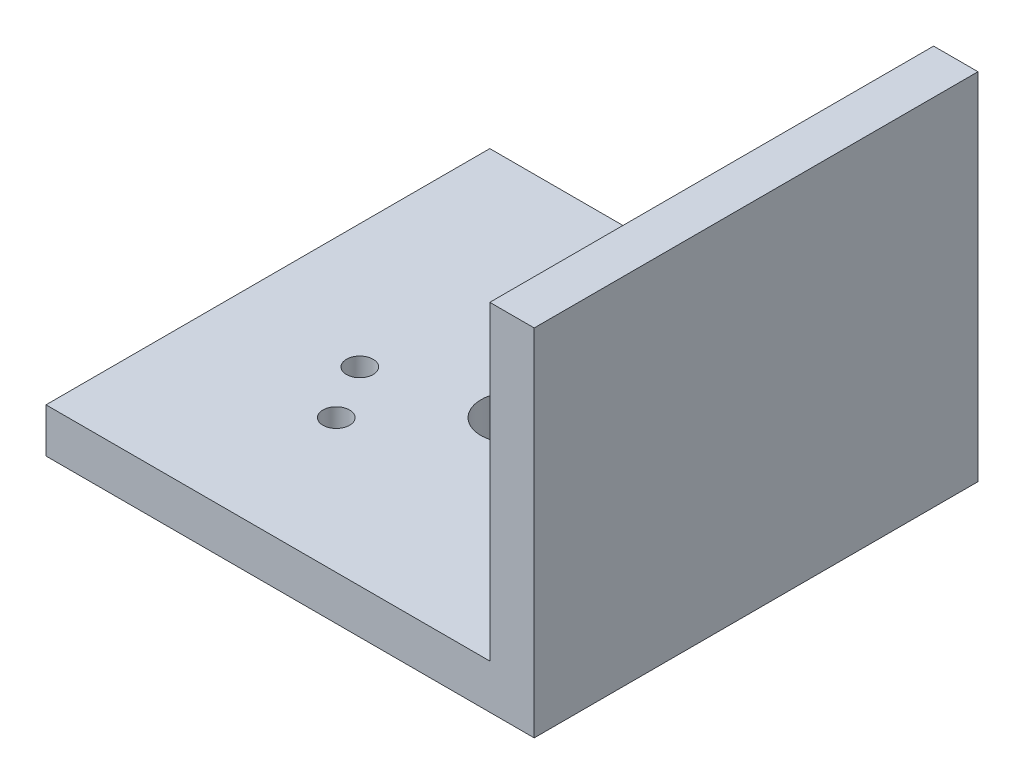
ISO-10303-21;
HEADER;
FILE_DESCRIPTION(('STEP AP214'),'2;1');
FILE_NAME('part.step','',(''),(''),'','','');
FILE_SCHEMA(('AUTOMOTIVE_DESIGN { 1 0 10303 214 1 1 1 1 }'));
ENDSEC;
DATA;
#1=APPLICATION_CONTEXT('core data for automotive mechanical design processes');
#2=APPLICATION_PROTOCOL_DEFINITION('international standard','automotive_design',2000,#1);
#3=PRODUCT_CONTEXT('',#1,'mechanical');
#4=PRODUCT('Part','Part','',(#3));
#5=PRODUCT_RELATED_PRODUCT_CATEGORY('part','',(#4));
#6=PRODUCT_DEFINITION_FORMATION('','',#4);
#7=PRODUCT_DEFINITION_CONTEXT('part definition',#1,'design');
#8=PRODUCT_DEFINITION('design','',#6,#7);
#9=PRODUCT_DEFINITION_SHAPE('','',#8);
#10=(LENGTH_UNIT() NAMED_UNIT(*) SI_UNIT(.MILLI.,.METRE.));
#11=(NAMED_UNIT(*) PLANE_ANGLE_UNIT() SI_UNIT($,.RADIAN.));
#12=(NAMED_UNIT(*) SI_UNIT($,.STERADIAN.) SOLID_ANGLE_UNIT());
#13=UNCERTAINTY_MEASURE_WITH_UNIT(LENGTH_MEASURE(1.E-05),#10,'distance_accuracy_value','');
#14=(GEOMETRIC_REPRESENTATION_CONTEXT(3) GLOBAL_UNCERTAINTY_ASSIGNED_CONTEXT((#13)) GLOBAL_UNIT_ASSIGNED_CONTEXT((#10,
#11,#12)) REPRESENTATION_CONTEXT('',''));
#15=CARTESIAN_POINT('',(0.,0.,0.));
#16=DIRECTION('',(0.,0.,1.));
#17=DIRECTION('',(1.,0.,0.));
#18=AXIS2_PLACEMENT_3D('',#15,#16,#17);
#19=CARTESIAN_POINT('',(-27.5,-2.5,25.));
#20=DIRECTION('',(1.,0.,0.));
#21=DIRECTION('',(0.,0.,-1.));
#22=AXIS2_PLACEMENT_3D('',#19,#20,#21);
#23=PLANE('',#22);
#24=DIRECTION('',(0.,-1.,0.));
#25=VECTOR('',#24,1.);
#26=CARTESIAN_POINT('',(-27.5,-2.5,-25.));
#27=LINE('',#26,#25);
#28=CARTESIAN_POINT('',(-27.5,2.5,-25.));
#29=VERTEX_POINT('',#28);
#30=CARTESIAN_POINT('',(-27.5,-2.5,-25.));
#31=VERTEX_POINT('',#30);
#32=EDGE_CURVE('E128',#29,#31,#27,.T.);
#33=ORIENTED_EDGE('',*,*,#32,.T.);
#34=DIRECTION('',(0.,0.,-1.));
#35=VECTOR('',#34,1.);
#36=CARTESIAN_POINT('',(-27.5,-2.5,25.));
#37=LINE('',#36,#35);
#38=CARTESIAN_POINT('',(-27.5,-2.5,25.));
#39=VERTEX_POINT('',#38);
#40=EDGE_CURVE('E11',#39,#31,#37,.T.);
#41=ORIENTED_EDGE('',*,*,#40,.F.);
#42=DIRECTION('',(0.,-1.,0.));
#43=VECTOR('',#42,1.);
#44=CARTESIAN_POINT('',(-27.5,-2.5,25.));
#45=LINE('',#44,#43);
#46=CARTESIAN_POINT('',(-27.5,2.5,25.));
#47=VERTEX_POINT('',#46);
#48=EDGE_CURVE('E145',#47,#39,#45,.T.);
#49=ORIENTED_EDGE('',*,*,#48,.F.);
#50=DIRECTION('',(0.,0.,-1.));
#51=VECTOR('',#50,1.);
#52=CARTESIAN_POINT('',(-27.5,2.5,25.));
#53=LINE('',#52,#51);
#54=EDGE_CURVE('E124',#47,#29,#53,.T.);
#55=ORIENTED_EDGE('',*,*,#54,.T.);
#56=EDGE_LOOP('',(#33,#41,#49,#55));
#57=FACE_BOUND('',#56,.T.);
#58=ADVANCED_FACE('F39',(#57),#23,.F.);
#59=CARTESIAN_POINT('',(27.5,-2.5,25.));
#60=DIRECTION('',(0.,1.,0.));
#61=DIRECTION('',(-1.,0.,0.));
#62=AXIS2_PLACEMENT_3D('',#59,#60,#61);
#63=PLANE('',#62);
#64=CARTESIAN_POINT('',(-9.89949493661161,-2.50000000000001,9.89949493661172));
#65=DIRECTION('',(0.,1.,0.));
#66=DIRECTION('',(0.500000000000004,0.,0.866025403784436));
#67=AXIS2_PLACEMENT_3D('',#64,#65,#66);
#68=CIRCLE('',#67,1.5);
#69=CARTESIAN_POINT('',(-9.14949493661161,-2.50000000000001,11.1985330422884));
#70=VERTEX_POINT('',#69);
#71=EDGE_CURVE('E296',#70,#70,#68,.T.);
#72=ORIENTED_EDGE('',*,*,#71,.T.);
#73=EDGE_LOOP('',(#72));
#74=FACE_BOUND('',#73,.T.);
#75=CARTESIAN_POINT('',(-13.522961568047,-2.50000000000001,3.62346663143535));
#76=DIRECTION('',(0.,1.,0.));
#77=DIRECTION('',(-0.500000000000004,0.,-0.866025403784436));
#78=AXIS2_PLACEMENT_3D('',#75,#76,#77);
#79=CIRCLE('',#78,1.5);
#80=CARTESIAN_POINT('',(-14.272961568047,-2.50000000000001,2.32442852575869));
#81=VERTEX_POINT('',#80);
#82=EDGE_CURVE('E300',#81,#81,#79,.T.);
#83=ORIENTED_EDGE('',*,*,#82,.T.);
#84=EDGE_LOOP('',(#83));
#85=FACE_BOUND('',#84,.T.);
#86=CARTESIAN_POINT('',(13.522961568047,-2.50000000000001,3.62346663143515));
#87=DIRECTION('',(0.,1.,0.));
#88=DIRECTION('',(0.499999999999992,0.,-0.866025403784443));
#89=AXIS2_PLACEMENT_3D('',#86,#87,#88);
#90=CIRCLE('',#89,1.5);
#91=CARTESIAN_POINT('',(14.272961568047,-2.50000000000001,2.32442852575849));
#92=VERTEX_POINT('',#91);
#93=EDGE_CURVE('E314',#92,#92,#90,.T.);
#94=ORIENTED_EDGE('',*,*,#93,.T.);
#95=EDGE_LOOP('',(#94));
#96=FACE_BOUND('',#95,.T.);
#97=CARTESIAN_POINT('',(9.89949493661176,-2.50000000000001,9.89949493661159));
#98=DIRECTION('',(0.,1.,0.));
#99=DIRECTION('',(-0.499999999999992,0.,0.866025403784443));
#100=AXIS2_PLACEMENT_3D('',#97,#98,#99);
#101=CIRCLE('',#100,1.5);
#102=CARTESIAN_POINT('',(9.14949493661177,-2.50000000000001,11.1985330422883));
#103=VERTEX_POINT('',#102);
#104=EDGE_CURVE('E322',#103,#103,#101,.T.);
#105=ORIENTED_EDGE('',*,*,#104,.T.);
#106=EDGE_LOOP('',(#105));
#107=FACE_BOUND('',#106,.T.);
#108=CARTESIAN_POINT('',(0.,-2.50000000000001,0.));
#109=DIRECTION('',(0.,1.,0.));
#110=DIRECTION('',(-1.,0.,0.));
#111=AXIS2_PLACEMENT_3D('',#108,#109,#110);
#112=CIRCLE('',#111,3.5);
#113=CARTESIAN_POINT('',(-3.5,-2.50000000000001,0.));
#114=VERTEX_POINT('',#113);
#115=EDGE_CURVE('E133',#114,#114,#112,.T.);
#116=ORIENTED_EDGE('',*,*,#115,.T.);
#117=EDGE_LOOP('',(#116));
#118=FACE_BOUND('',#117,.T.);
#119=CARTESIAN_POINT('',(-3.6234666314353,-2.50000000000001,-13.522961568047));
#120=DIRECTION('',(0.,1.,0.));
#121=DIRECTION('',(-1.,0.,0.));
#122=AXIS2_PLACEMENT_3D('',#119,#120,#121);
#123=CIRCLE('',#122,1.5);
#124=CARTESIAN_POINT('',(-5.1234666314353,-2.50000000000001,-13.522961568047));
#125=VERTEX_POINT('',#124);
#126=EDGE_CURVE('E330',#125,#125,#123,.T.);
#127=ORIENTED_EDGE('',*,*,#126,.T.);
#128=EDGE_LOOP('',(#127));
#129=FACE_BOUND('',#128,.T.);
#130=CARTESIAN_POINT('',(3.6234666314353,-2.50000000000001,-13.522961568047));
#131=DIRECTION('',(0.,1.,0.));
#132=DIRECTION('',(1.,0.,0.));
#133=AXIS2_PLACEMENT_3D('',#130,#131,#132);
#134=CIRCLE('',#133,1.5);
#135=CARTESIAN_POINT('',(5.1234666314353,-2.50000000000001,-13.522961568047));
#136=VERTEX_POINT('',#135);
#137=EDGE_CURVE('E338',#136,#136,#134,.T.);
#138=ORIENTED_EDGE('',*,*,#137,.T.);
#139=EDGE_LOOP('',(#138));
#140=FACE_BOUND('',#139,.T.);
#141=DIRECTION('',(1.,0.,0.));
#142=VECTOR('',#141,1.);
#143=CARTESIAN_POINT('',(27.5,-2.5,-25.));
#144=LINE('',#143,#142);
#145=CARTESIAN_POINT('',(27.5,-2.5,-25.));
#146=VERTEX_POINT('',#145);
#147=EDGE_CURVE('E132',#31,#146,#144,.T.);
#148=ORIENTED_EDGE('',*,*,#147,.T.);
#149=DIRECTION('',(0.,0.,-1.));
#150=VECTOR('',#149,1.);
#151=CARTESIAN_POINT('',(27.5,-2.5,25.));
#152=LINE('',#151,#150);
#153=CARTESIAN_POINT('',(27.5,-2.5,25.));
#154=VERTEX_POINT('',#153);
#155=EDGE_CURVE('E48',#154,#146,#152,.T.);
#156=ORIENTED_EDGE('',*,*,#155,.F.);
#157=DIRECTION('',(1.,0.,0.));
#158=VECTOR('',#157,1.);
#159=CARTESIAN_POINT('',(22.5,-2.5,25.));
#160=LINE('',#159,#158);
#161=EDGE_CURVE('E93',#39,#154,#160,.T.);
#162=ORIENTED_EDGE('',*,*,#161,.F.);
#163=ORIENTED_EDGE('',*,*,#40,.T.);
#164=EDGE_LOOP('',(#148,#156,#162,#163));
#165=FACE_BOUND('',#164,.T.);
#166=ADVANCED_FACE('F176',(#74,#85,#96,#107,#118,#129,#140,#165),#63,.F.);
#167=CARTESIAN_POINT('',(27.5,-2.5,25.));
#168=DIRECTION('',(-1.,0.,0.));
#169=DIRECTION('',(0.,0.,1.));
#170=AXIS2_PLACEMENT_3D('',#167,#168,#169);
#171=PLANE('',#170);
#172=DIRECTION('',(0.,1.,0.));
#173=VECTOR('',#172,1.);
#174=CARTESIAN_POINT('',(27.5,-2.5,-25.));
#175=LINE('',#174,#173);
#176=CARTESIAN_POINT('',(27.5,37.5,-25.));
#177=VERTEX_POINT('',#176);
#178=EDGE_CURVE('E136',#146,#177,#175,.T.);
#179=ORIENTED_EDGE('',*,*,#178,.T.);
#180=DIRECTION('',(0.,0.,-1.));
#181=VECTOR('',#180,1.);
#182=CARTESIAN_POINT('',(27.5,37.5,25.));
#183=LINE('',#182,#181);
#184=CARTESIAN_POINT('',(27.5,37.5,25.));
#185=VERTEX_POINT('',#184);
#186=EDGE_CURVE('E117',#185,#177,#183,.T.);
#187=ORIENTED_EDGE('',*,*,#186,.F.);
#188=DIRECTION('',(0.,1.,0.));
#189=VECTOR('',#188,1.);
#190=CARTESIAN_POINT('',(27.5,-2.5,25.));
#191=LINE('',#190,#189);
#192=EDGE_CURVE('E106',#154,#185,#191,.T.);
#193=ORIENTED_EDGE('',*,*,#192,.F.);
#194=ORIENTED_EDGE('',*,*,#155,.T.);
#195=EDGE_LOOP('',(#179,#187,#193,#194));
#196=FACE_BOUND('',#195,.T.);
#197=ADVANCED_FACE('F155',(#196),#171,.F.);
#198=CARTESIAN_POINT('',(27.5,37.5,25.));
#199=DIRECTION('',(0.,-1.,0.));
#200=DIRECTION('',(0.,0.,-1.));
#201=AXIS2_PLACEMENT_3D('',#198,#199,#200);
#202=PLANE('',#201);
#203=DIRECTION('',(-1.,0.,0.));
#204=VECTOR('',#203,1.);
#205=CARTESIAN_POINT('',(27.5,37.5,-25.));
#206=LINE('',#205,#204);
#207=CARTESIAN_POINT('',(22.5,37.5,-25.));
#208=VERTEX_POINT('',#207);
#209=EDGE_CURVE('E115',#177,#208,#206,.T.);
#210=ORIENTED_EDGE('',*,*,#209,.T.);
#211=DIRECTION('',(0.,0.,-1.));
#212=VECTOR('',#211,1.);
#213=CARTESIAN_POINT('',(22.5,37.5,25.));
#214=LINE('',#213,#212);
#215=CARTESIAN_POINT('',(22.5,37.5,25.));
#216=VERTEX_POINT('',#215);
#217=EDGE_CURVE('E112',#216,#208,#214,.T.);
#218=ORIENTED_EDGE('',*,*,#217,.F.);
#219=DIRECTION('',(-1.,0.,0.));
#220=VECTOR('',#219,1.);
#221=CARTESIAN_POINT('',(27.5,37.5,25.));
#222=LINE('',#221,#220);
#223=EDGE_CURVE('E100',#185,#216,#222,.T.);
#224=ORIENTED_EDGE('',*,*,#223,.F.);
#225=ORIENTED_EDGE('',*,*,#186,.T.);
#226=EDGE_LOOP('',(#210,#218,#224,#225));
#227=FACE_BOUND('',#226,.T.);
#228=ADVANCED_FACE('F113',(#227),#202,.F.);
#229=CARTESIAN_POINT('',(22.5,2.5,25.));
#230=DIRECTION('',(1.,0.,0.));
#231=DIRECTION('',(0.,0.,-1.));
#232=AXIS2_PLACEMENT_3D('',#229,#230,#231);
#233=PLANE('',#232);
#234=DIRECTION('',(0.,-1.,0.));
#235=VECTOR('',#234,1.);
#236=CARTESIAN_POINT('',(22.5,2.5,-25.));
#237=LINE('',#236,#235);
#238=CARTESIAN_POINT('',(22.5,2.5,-25.));
#239=VERTEX_POINT('',#238);
#240=EDGE_CURVE('E79',#208,#239,#237,.T.);
#241=ORIENTED_EDGE('',*,*,#240,.T.);
#242=DIRECTION('',(0.,0.,-1.));
#243=VECTOR('',#242,1.);
#244=CARTESIAN_POINT('',(22.5,2.5,25.));
#245=LINE('',#244,#243);
#246=CARTESIAN_POINT('',(22.5,2.5,25.));
#247=VERTEX_POINT('',#246);
#248=EDGE_CURVE('E118',#247,#239,#245,.T.);
#249=ORIENTED_EDGE('',*,*,#248,.F.);
#250=DIRECTION('',(0.,-1.,0.));
#251=VECTOR('',#250,1.);
#252=CARTESIAN_POINT('',(22.5,2.5,25.));
#253=LINE('',#252,#251);
#254=EDGE_CURVE('E104',#216,#247,#253,.T.);
#255=ORIENTED_EDGE('',*,*,#254,.F.);
#256=ORIENTED_EDGE('',*,*,#217,.T.);
#257=EDGE_LOOP('',(#241,#249,#255,#256));
#258=FACE_BOUND('',#257,.T.);
#259=ADVANCED_FACE('F120',(#258),#233,.F.);
#260=CARTESIAN_POINT('',(22.5,2.5,25.));
#261=DIRECTION('',(0.,-1.,0.));
#262=DIRECTION('',(1.,0.,0.));
#263=AXIS2_PLACEMENT_3D('',#260,#261,#262);
#264=PLANE('',#263);
#265=CARTESIAN_POINT('',(-9.89949493661161,2.5,9.89949493661172));
#266=DIRECTION('',(0.,1.,0.));
#267=DIRECTION('',(0.500000000000004,0.,0.866025403784436));
#268=AXIS2_PLACEMENT_3D('',#265,#266,#267);
#269=CIRCLE('',#268,1.5);
#270=CARTESIAN_POINT('',(-9.14949493661161,2.5,11.1985330422884));
#271=VERTEX_POINT('',#270);
#272=EDGE_CURVE('E298',#271,#271,#269,.T.);
#273=ORIENTED_EDGE('',*,*,#272,.F.);
#274=EDGE_LOOP('',(#273));
#275=FACE_BOUND('',#274,.T.);
#276=CARTESIAN_POINT('',(-13.522961568047,2.5,3.62346663143535));
#277=DIRECTION('',(0.,1.,0.));
#278=DIRECTION('',(-0.500000000000004,0.,-0.866025403784436));
#279=AXIS2_PLACEMENT_3D('',#276,#277,#278);
#280=CIRCLE('',#279,1.5);
#281=CARTESIAN_POINT('',(-14.272961568047,2.5,2.32442852575869));
#282=VERTEX_POINT('',#281);
#283=EDGE_CURVE('E307',#282,#282,#280,.T.);
#284=ORIENTED_EDGE('',*,*,#283,.F.);
#285=EDGE_LOOP('',(#284));
#286=FACE_BOUND('',#285,.T.);
#287=CARTESIAN_POINT('',(13.522961568047,2.5,3.62346663143515));
#288=DIRECTION('',(0.,1.,0.));
#289=DIRECTION('',(0.499999999999992,0.,-0.866025403784443));
#290=AXIS2_PLACEMENT_3D('',#287,#288,#289);
#291=CIRCLE('',#290,1.5);
#292=CARTESIAN_POINT('',(14.272961568047,2.5,2.32442852575849));
#293=VERTEX_POINT('',#292);
#294=EDGE_CURVE('E318',#293,#293,#291,.T.);
#295=ORIENTED_EDGE('',*,*,#294,.F.);
#296=EDGE_LOOP('',(#295));
#297=FACE_BOUND('',#296,.T.);
#298=CARTESIAN_POINT('',(9.89949493661176,2.5,9.89949493661159));
#299=DIRECTION('',(0.,1.,0.));
#300=DIRECTION('',(-0.499999999999992,0.,0.866025403784443));
#301=AXIS2_PLACEMENT_3D('',#298,#299,#300);
#302=CIRCLE('',#301,1.5);
#303=CARTESIAN_POINT('',(9.14949493661177,2.5,11.1985330422883));
#304=VERTEX_POINT('',#303);
#305=EDGE_CURVE('E368',#304,#304,#302,.T.);
#306=ORIENTED_EDGE('',*,*,#305,.F.);
#307=EDGE_LOOP('',(#306));
#308=FACE_BOUND('',#307,.T.);
#309=CARTESIAN_POINT('',(0.,2.5,0.));
#310=DIRECTION('',(0.,1.,0.));
#311=DIRECTION('',(-1.,0.,0.));
#312=AXIS2_PLACEMENT_3D('',#309,#310,#311);
#313=CIRCLE('',#312,3.5);
#314=CARTESIAN_POINT('',(-3.5,2.5,0.));
#315=VERTEX_POINT('',#314);
#316=EDGE_CURVE('E326',#315,#315,#313,.T.);
#317=ORIENTED_EDGE('',*,*,#316,.F.);
#318=EDGE_LOOP('',(#317));
#319=FACE_BOUND('',#318,.T.);
#320=CARTESIAN_POINT('',(-3.6234666314353,2.5,-13.522961568047));
#321=DIRECTION('',(0.,1.,0.));
#322=DIRECTION('',(-1.,0.,0.));
#323=AXIS2_PLACEMENT_3D('',#320,#321,#322);
#324=CIRCLE('',#323,1.5);
#325=CARTESIAN_POINT('',(-5.1234666314353,2.5,-13.522961568047));
#326=VERTEX_POINT('',#325);
#327=EDGE_CURVE('E334',#326,#326,#324,.T.);
#328=ORIENTED_EDGE('',*,*,#327,.F.);
#329=EDGE_LOOP('',(#328));
#330=FACE_BOUND('',#329,.T.);
#331=CARTESIAN_POINT('',(3.6234666314353,2.5,-13.522961568047));
#332=DIRECTION('',(0.,1.,0.));
#333=DIRECTION('',(1.,0.,0.));
#334=AXIS2_PLACEMENT_3D('',#331,#332,#333);
#335=CIRCLE('',#334,1.5);
#336=CARTESIAN_POINT('',(5.1234666314353,2.5,-13.522961568047));
#337=VERTEX_POINT('',#336);
#338=EDGE_CURVE('E304',#337,#337,#335,.T.);
#339=ORIENTED_EDGE('',*,*,#338,.F.);
#340=EDGE_LOOP('',(#339));
#341=FACE_BOUND('',#340,.T.);
#342=DIRECTION('',(-1.,0.,0.));
#343=VECTOR('',#342,1.);
#344=CARTESIAN_POINT('',(22.5,2.5,-25.));
#345=LINE('',#344,#343);
#346=EDGE_CURVE('E85',#239,#29,#345,.T.);
#347=ORIENTED_EDGE('',*,*,#346,.T.);
#348=ORIENTED_EDGE('',*,*,#54,.F.);
#349=DIRECTION('',(-1.,0.,0.));
#350=VECTOR('',#349,1.);
#351=CARTESIAN_POINT('',(22.5,2.5,25.));
#352=LINE('',#351,#350);
#353=EDGE_CURVE('E56',#247,#47,#352,.T.);
#354=ORIENTED_EDGE('',*,*,#353,.F.);
#355=ORIENTED_EDGE('',*,*,#248,.T.);
#356=EDGE_LOOP('',(#347,#348,#354,#355));
#357=FACE_BOUND('',#356,.T.);
#358=ADVANCED_FACE('F162',(#275,#286,#297,#308,#319,#330,#341,#357),#264,.F.);
#359=CARTESIAN_POINT('',(0.,0.,25.));
#360=DIRECTION('',(0.,0.,1.));
#361=DIRECTION('',(1.,0.,0.));
#362=AXIS2_PLACEMENT_3D('',#359,#360,#361);
#363=PLANE('',#362);
#364=ORIENTED_EDGE('',*,*,#48,.T.);
#365=ORIENTED_EDGE('',*,*,#161,.T.);
#366=ORIENTED_EDGE('',*,*,#192,.T.);
#367=ORIENTED_EDGE('',*,*,#223,.T.);
#368=ORIENTED_EDGE('',*,*,#254,.T.);
#369=ORIENTED_EDGE('',*,*,#353,.T.);
#370=EDGE_LOOP('',(#364,#365,#366,#367,#368,#369));
#371=FACE_BOUND('',#370,.T.);
#372=ADVANCED_FACE('F102',(#371),#363,.T.);
#373=CARTESIAN_POINT('',(0.,0.,-25.));
#374=DIRECTION('',(0.,0.,1.));
#375=DIRECTION('',(1.,0.,0.));
#376=AXIS2_PLACEMENT_3D('',#373,#374,#375);
#377=PLANE('',#376);
#378=ORIENTED_EDGE('',*,*,#32,.F.);
#379=ORIENTED_EDGE('',*,*,#346,.F.);
#380=ORIENTED_EDGE('',*,*,#240,.F.);
#381=ORIENTED_EDGE('',*,*,#209,.F.);
#382=ORIENTED_EDGE('',*,*,#178,.F.);
#383=ORIENTED_EDGE('',*,*,#147,.F.);
#384=EDGE_LOOP('',(#378,#379,#380,#381,#382,#383));
#385=FACE_BOUND('',#384,.T.);
#386=ADVANCED_FACE('F158',(#385),#377,.F.);
#387=CARTESIAN_POINT('',(3.6234666314353,-2.50000000000001,-13.522961568047));
#388=DIRECTION('',(0.,1.,0.));
#389=DIRECTION('',(-1.,0.,0.));
#390=AXIS2_PLACEMENT_3D('',#387,#388,#389);
#391=CYLINDRICAL_SURFACE('',#390,1.5);
#392=ORIENTED_EDGE('',*,*,#137,.F.);
#393=EDGE_LOOP('',(#392));
#394=FACE_BOUND('',#393,.T.);
#395=ORIENTED_EDGE('',*,*,#338,.T.);
#396=EDGE_LOOP('',(#395));
#397=FACE_BOUND('',#396,.T.);
#398=ADVANCED_FACE('F213',(#394,#397),#391,.F.);
#399=CARTESIAN_POINT('',(-3.6234666314353,-2.50000000000001,-13.522961568047));
#400=DIRECTION('',(0.,1.,0.));
#401=DIRECTION('',(-1.,0.,0.));
#402=AXIS2_PLACEMENT_3D('',#399,#400,#401);
#403=CYLINDRICAL_SURFACE('',#402,1.5);
#404=ORIENTED_EDGE('',*,*,#126,.F.);
#405=EDGE_LOOP('',(#404));
#406=FACE_BOUND('',#405,.T.);
#407=ORIENTED_EDGE('',*,*,#327,.T.);
#408=EDGE_LOOP('',(#407));
#409=FACE_BOUND('',#408,.T.);
#410=ADVANCED_FACE('F221',(#406,#409),#403,.F.);
#411=CARTESIAN_POINT('',(0.,-2.50000000000001,0.));
#412=DIRECTION('',(0.,1.,0.));
#413=DIRECTION('',(-1.,0.,0.));
#414=AXIS2_PLACEMENT_3D('',#411,#412,#413);
#415=CYLINDRICAL_SURFACE('',#414,3.5);
#416=ORIENTED_EDGE('',*,*,#115,.F.);
#417=EDGE_LOOP('',(#416));
#418=FACE_BOUND('',#417,.T.);
#419=ORIENTED_EDGE('',*,*,#316,.T.);
#420=EDGE_LOOP('',(#419));
#421=FACE_BOUND('',#420,.T.);
#422=ADVANCED_FACE('F231',(#418,#421),#415,.F.);
#423=CARTESIAN_POINT('',(9.89949493661176,-2.50000000000001,9.89949493661159));
#424=DIRECTION('',(0.,1.,0.));
#425=DIRECTION('',(-1.,0.,0.));
#426=AXIS2_PLACEMENT_3D('',#423,#424,#425);
#427=CYLINDRICAL_SURFACE('',#426,1.5);
#428=ORIENTED_EDGE('',*,*,#104,.F.);
#429=EDGE_LOOP('',(#428));
#430=FACE_BOUND('',#429,.T.);
#431=ORIENTED_EDGE('',*,*,#305,.T.);
#432=EDGE_LOOP('',(#431));
#433=FACE_BOUND('',#432,.T.);
#434=ADVANCED_FACE('F240',(#430,#433),#427,.F.);
#435=CARTESIAN_POINT('',(13.522961568047,-2.50000000000001,3.62346663143515));
#436=DIRECTION('',(0.,1.,0.));
#437=DIRECTION('',(-1.,0.,0.));
#438=AXIS2_PLACEMENT_3D('',#435,#436,#437);
#439=CYLINDRICAL_SURFACE('',#438,1.5);
#440=ORIENTED_EDGE('',*,*,#93,.F.);
#441=EDGE_LOOP('',(#440));
#442=FACE_BOUND('',#441,.T.);
#443=ORIENTED_EDGE('',*,*,#294,.T.);
#444=EDGE_LOOP('',(#443));
#445=FACE_BOUND('',#444,.T.);
#446=ADVANCED_FACE('F260',(#442,#445),#439,.F.);
#447=CARTESIAN_POINT('',(-13.522961568047,-2.50000000000001,3.62346663143535));
#448=DIRECTION('',(0.,1.,0.));
#449=DIRECTION('',(-1.,0.,0.));
#450=AXIS2_PLACEMENT_3D('',#447,#448,#449);
#451=CYLINDRICAL_SURFACE('',#450,1.5);
#452=ORIENTED_EDGE('',*,*,#82,.F.);
#453=EDGE_LOOP('',(#452));
#454=FACE_BOUND('',#453,.T.);
#455=ORIENTED_EDGE('',*,*,#283,.T.);
#456=EDGE_LOOP('',(#455));
#457=FACE_BOUND('',#456,.T.);
#458=ADVANCED_FACE('F270',(#454,#457),#451,.F.);
#459=CARTESIAN_POINT('',(-9.89949493661161,-2.50000000000001,9.89949493661172));
#460=DIRECTION('',(0.,1.,0.));
#461=DIRECTION('',(-1.,0.,0.));
#462=AXIS2_PLACEMENT_3D('',#459,#460,#461);
#463=CYLINDRICAL_SURFACE('',#462,1.5);
#464=ORIENTED_EDGE('',*,*,#71,.F.);
#465=EDGE_LOOP('',(#464));
#466=FACE_BOUND('',#465,.T.);
#467=ORIENTED_EDGE('',*,*,#272,.T.);
#468=EDGE_LOOP('',(#467));
#469=FACE_BOUND('',#468,.T.);
#470=ADVANCED_FACE('F280',(#466,#469),#463,.F.);
#471=CLOSED_SHELL('',(#58,#166,#197,#228,#259,#358,#372,#386,#398,#410,#422,#434,#446,#458,#470));
#472=MANIFOLD_SOLID_BREP('B2',#471);
#473=ADVANCED_BREP_SHAPE_REPRESENTATION('',(#18,#472),#14);
#474=SHAPE_DEFINITION_REPRESENTATION(#9,#473);
ENDSEC;
END-ISO-10303-21;
